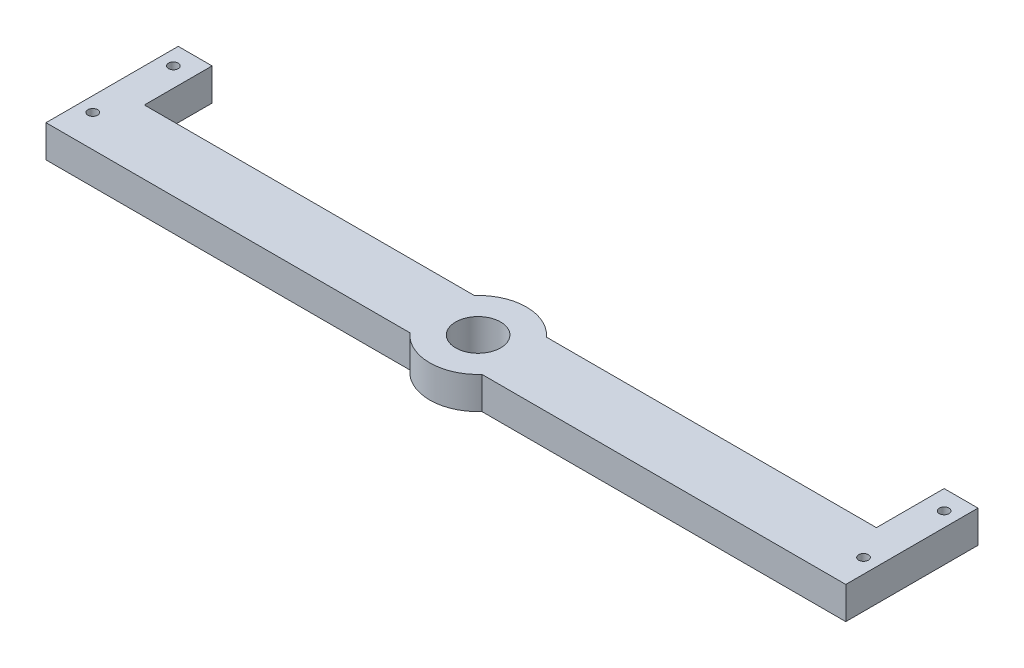
ISO-10303-21;
HEADER;
FILE_DESCRIPTION(('STEP AP214'),'2;1');
FILE_NAME('part.step','',(''),(''),'','','');
FILE_SCHEMA(('AUTOMOTIVE_DESIGN { 1 0 10303 214 1 1 1 1 }'));
ENDSEC;
DATA;
#1=APPLICATION_CONTEXT('core data for automotive mechanical design processes');
#2=APPLICATION_PROTOCOL_DEFINITION('international standard','automotive_design',2000,#1);
#3=PRODUCT_CONTEXT('',#1,'mechanical');
#4=PRODUCT('Part','Part','',(#3));
#5=PRODUCT_RELATED_PRODUCT_CATEGORY('part','',(#4));
#6=PRODUCT_DEFINITION_FORMATION('','',#4);
#7=PRODUCT_DEFINITION_CONTEXT('part definition',#1,'design');
#8=PRODUCT_DEFINITION('design','',#6,#7);
#9=PRODUCT_DEFINITION_SHAPE('','',#8);
#10=(LENGTH_UNIT() NAMED_UNIT(*) SI_UNIT(.MILLI.,.METRE.));
#11=(NAMED_UNIT(*) PLANE_ANGLE_UNIT() SI_UNIT($,.RADIAN.));
#12=(NAMED_UNIT(*) SI_UNIT($,.STERADIAN.) SOLID_ANGLE_UNIT());
#13=UNCERTAINTY_MEASURE_WITH_UNIT(LENGTH_MEASURE(1.E-05),#10,'distance_accuracy_value','');
#14=(GEOMETRIC_REPRESENTATION_CONTEXT(3) GLOBAL_UNCERTAINTY_ASSIGNED_CONTEXT((#13)) GLOBAL_UNIT_ASSIGNED_CONTEXT((#10,
#11,#12)) REPRESENTATION_CONTEXT('',''));
#15=CARTESIAN_POINT('',(0.,0.,0.));
#16=DIRECTION('',(0.,0.,1.));
#17=DIRECTION('',(1.,0.,0.));
#18=AXIS2_PLACEMENT_3D('',#15,#16,#17);
#19=CARTESIAN_POINT('',(0.,10.,0.));
#20=DIRECTION('',(0.,1.,0.));
#21=DIRECTION('',(0.,0.,1.));
#22=AXIS2_PLACEMENT_3D('',#19,#20,#21);
#23=PLANE('',#22);
#24=CARTESIAN_POINT('',(-119.5,10.,-25.));
#25=DIRECTION('',(0.,1.,0.));
#26=DIRECTION('',(0.,0.,1.));
#27=AXIS2_PLACEMENT_3D('',#24,#25,#26);
#28=CIRCLE('',#27,1.5);
#29=CARTESIAN_POINT('',(-119.5,10.,-23.5));
#30=VERTEX_POINT('',#29);
#31=EDGE_CURVE('E312',#30,#30,#28,.T.);
#32=ORIENTED_EDGE('',*,*,#31,.F.);
#33=EDGE_LOOP('',(#32));
#34=FACE_BOUND('',#33,.T.);
#35=CARTESIAN_POINT('',(119.5,10.,-4.42238838142354E-13));
#36=DIRECTION('',(0.,1.,0.));
#37=DIRECTION('',(0.,0.,-1.));
#38=AXIS2_PLACEMENT_3D('',#35,#36,#37);
#39=CIRCLE('',#38,1.5);
#40=CARTESIAN_POINT('',(119.5,10.,-1.50000000000044));
#41=VERTEX_POINT('',#40);
#42=EDGE_CURVE('E296',#41,#41,#39,.T.);
#43=ORIENTED_EDGE('',*,*,#42,.F.);
#44=EDGE_LOOP('',(#43));
#45=FACE_BOUND('',#44,.T.);
#46=DIRECTION('',(0.,0.,-1.));
#47=VECTOR('',#46,1.);
#48=CARTESIAN_POINT('',(124.,10.,-10.));
#49=LINE('',#48,#47);
#50=CARTESIAN_POINT('',(124.,10.,10.));
#51=VERTEX_POINT('',#50);
#52=CARTESIAN_POINT('',(124.,10.,-31.));
#53=VERTEX_POINT('',#52);
#54=EDGE_CURVE('E57',#51,#53,#49,.T.);
#55=ORIENTED_EDGE('',*,*,#54,.T.);
#56=DIRECTION('',(-1.,0.,0.));
#57=VECTOR('',#56,1.);
#58=CARTESIAN_POINT('',(124.,10.,-31.));
#59=LINE('',#58,#57);
#60=CARTESIAN_POINT('',(113.5,10.,-31.));
#61=VERTEX_POINT('',#60);
#62=EDGE_CURVE('E113',#53,#61,#59,.T.);
#63=ORIENTED_EDGE('',*,*,#62,.T.);
#64=DIRECTION('',(0.,0.,1.));
#65=VECTOR('',#64,1.);
#66=CARTESIAN_POINT('',(113.5,10.,-31.));
#67=LINE('',#66,#65);
#68=CARTESIAN_POINT('',(113.5,10.,-10.0000000000004));
#69=VERTEX_POINT('',#68);
#70=EDGE_CURVE('E240',#61,#69,#67,.T.);
#71=ORIENTED_EDGE('',*,*,#70,.T.);
#72=DIRECTION('',(-1.,0.,0.));
#73=VECTOR('',#72,1.);
#74=CARTESIAN_POINT('',(11.1803398874989,10.,-10.));
#75=LINE('',#74,#73);
#76=CARTESIAN_POINT('',(11.1803398874989,10.,-10.));
#77=VERTEX_POINT('',#76);
#78=EDGE_CURVE('E261',#69,#77,#75,.T.);
#79=ORIENTED_EDGE('',*,*,#78,.T.);
#80=CARTESIAN_POINT('',(0.,10.,0.));
#81=DIRECTION('',(0.,1.,0.));
#82=DIRECTION('',(0.,0.,1.));
#83=AXIS2_PLACEMENT_3D('',#80,#81,#82);
#84=CIRCLE('',#83,15.);
#85=CARTESIAN_POINT('',(-11.1803398874989,10.,-10.));
#86=VERTEX_POINT('',#85);
#87=EDGE_CURVE('E257',#77,#86,#84,.T.);
#88=ORIENTED_EDGE('',*,*,#87,.T.);
#89=DIRECTION('',(-1.,0.,0.));
#90=VECTOR('',#89,1.);
#91=CARTESIAN_POINT('',(-113.5,10.,-10.));
#92=LINE('',#91,#90);
#93=CARTESIAN_POINT('',(-113.5,10.,-10.));
#94=VERTEX_POINT('',#93);
#95=EDGE_CURVE('E260',#86,#94,#92,.T.);
#96=ORIENTED_EDGE('',*,*,#95,.T.);
#97=DIRECTION('',(0.,0.,-1.));
#98=VECTOR('',#97,1.);
#99=CARTESIAN_POINT('',(-113.5,10.,-31.));
#100=LINE('',#99,#98);
#101=CARTESIAN_POINT('',(-113.5,10.,-31.));
#102=VERTEX_POINT('',#101);
#103=EDGE_CURVE('E265',#94,#102,#100,.T.);
#104=ORIENTED_EDGE('',*,*,#103,.T.);
#105=DIRECTION('',(-1.,0.,0.));
#106=VECTOR('',#105,1.);
#107=CARTESIAN_POINT('',(-124.,10.,-31.));
#108=LINE('',#107,#106);
#109=CARTESIAN_POINT('',(-124.,10.,-31.));
#110=VERTEX_POINT('',#109);
#111=EDGE_CURVE('E272',#102,#110,#108,.T.);
#112=ORIENTED_EDGE('',*,*,#111,.T.);
#113=DIRECTION('',(0.,0.,1.));
#114=VECTOR('',#113,1.);
#115=CARTESIAN_POINT('',(-124.,10.,-10.));
#116=LINE('',#115,#114);
#117=CARTESIAN_POINT('',(-124.,10.,10.));
#118=VERTEX_POINT('',#117);
#119=EDGE_CURVE('E145',#110,#118,#116,.T.);
#120=ORIENTED_EDGE('',*,*,#119,.T.);
#121=DIRECTION('',(1.,0.,0.));
#122=VECTOR('',#121,1.);
#123=CARTESIAN_POINT('',(-124.,10.,10.));
#124=LINE('',#123,#122);
#125=CARTESIAN_POINT('',(-11.1803398874989,10.,10.));
#126=VERTEX_POINT('',#125);
#127=EDGE_CURVE('E139',#118,#126,#124,.T.);
#128=ORIENTED_EDGE('',*,*,#127,.T.);
#129=CARTESIAN_POINT('',(0.,10.,0.));
#130=DIRECTION('',(0.,1.,0.));
#131=DIRECTION('',(0.,0.,1.));
#132=AXIS2_PLACEMENT_3D('',#129,#130,#131);
#133=CIRCLE('',#132,15.);
#134=CARTESIAN_POINT('',(11.1803398874989,10.,10.));
#135=VERTEX_POINT('',#134);
#136=EDGE_CURVE('E143',#126,#135,#133,.T.);
#137=ORIENTED_EDGE('',*,*,#136,.T.);
#138=DIRECTION('',(1.,0.,0.));
#139=VECTOR('',#138,1.);
#140=CARTESIAN_POINT('',(11.1803398874989,10.,10.));
#141=LINE('',#140,#139);
#142=EDGE_CURVE('E162',#135,#51,#141,.T.);
#143=ORIENTED_EDGE('',*,*,#142,.T.);
#144=EDGE_LOOP('',(#55,#63,#71,#79,#88,#96,#104,#112,#120,#128,#137,#143));
#145=FACE_BOUND('',#144,.T.);
#146=CARTESIAN_POINT('',(-119.5,10.,0.));
#147=DIRECTION('',(0.,1.,0.));
#148=DIRECTION('',(0.,0.,1.));
#149=AXIS2_PLACEMENT_3D('',#146,#147,#148);
#150=CIRCLE('',#149,1.5);
#151=CARTESIAN_POINT('',(-119.5,10.,1.5));
#152=VERTEX_POINT('',#151);
#153=EDGE_CURVE('E173',#152,#152,#150,.T.);
#154=ORIENTED_EDGE('',*,*,#153,.F.);
#155=EDGE_LOOP('',(#154));
#156=FACE_BOUND('',#155,.T.);
#157=CARTESIAN_POINT('',(0.,10.,0.));
#158=DIRECTION('',(0.,1.,0.));
#159=DIRECTION('',(0.,0.,1.));
#160=AXIS2_PLACEMENT_3D('',#157,#158,#159);
#161=CIRCLE('',#160,6.975);
#162=CARTESIAN_POINT('',(0.,10.,6.975));
#163=VERTEX_POINT('',#162);
#164=EDGE_CURVE('E304',#163,#163,#161,.T.);
#165=ORIENTED_EDGE('',*,*,#164,.F.);
#166=EDGE_LOOP('',(#165));
#167=FACE_BOUND('',#166,.T.);
#168=CARTESIAN_POINT('',(119.5,10.,-25.));
#169=DIRECTION('',(0.,1.,0.));
#170=DIRECTION('',(0.,0.,-1.));
#171=AXIS2_PLACEMENT_3D('',#168,#169,#170);
#172=CIRCLE('',#171,1.5);
#173=CARTESIAN_POINT('',(119.5,10.,-26.5));
#174=VERTEX_POINT('',#173);
#175=EDGE_CURVE('E320',#174,#174,#172,.T.);
#176=ORIENTED_EDGE('',*,*,#175,.F.);
#177=EDGE_LOOP('',(#176));
#178=FACE_BOUND('',#177,.T.);
#179=ADVANCED_FACE('F39',(#34,#45,#145,#156,#167,#178),#23,.T.);
#180=CARTESIAN_POINT('',(0.,0.,0.));
#181=DIRECTION('',(0.,1.,0.));
#182=DIRECTION('',(0.,0.,1.));
#183=AXIS2_PLACEMENT_3D('',#180,#181,#182);
#184=PLANE('',#183);
#185=DIRECTION('',(-1.,0.,0.));
#186=VECTOR('',#185,1.);
#187=CARTESIAN_POINT('',(124.,0.,-31.));
#188=LINE('',#187,#186);
#189=CARTESIAN_POINT('',(124.,0.,-31.));
#190=VERTEX_POINT('',#189);
#191=CARTESIAN_POINT('',(113.5,0.,-31.));
#192=VERTEX_POINT('',#191);
#193=EDGE_CURVE('E169',#190,#192,#188,.T.);
#194=ORIENTED_EDGE('',*,*,#193,.F.);
#195=DIRECTION('',(0.,0.,-1.));
#196=VECTOR('',#195,1.);
#197=CARTESIAN_POINT('',(124.,0.,10.));
#198=LINE('',#197,#196);
#199=CARTESIAN_POINT('',(124.,0.,10.));
#200=VERTEX_POINT('',#199);
#201=EDGE_CURVE('E201',#200,#190,#198,.T.);
#202=ORIENTED_EDGE('',*,*,#201,.F.);
#203=DIRECTION('',(1.,0.,0.));
#204=VECTOR('',#203,1.);
#205=CARTESIAN_POINT('',(11.1803398874989,0.,10.));
#206=LINE('',#205,#204);
#207=CARTESIAN_POINT('',(11.1803398874989,0.,10.));
#208=VERTEX_POINT('',#207);
#209=EDGE_CURVE('E106',#208,#200,#206,.T.);
#210=ORIENTED_EDGE('',*,*,#209,.F.);
#211=CARTESIAN_POINT('',(0.,0.,0.));
#212=DIRECTION('',(0.,1.,0.));
#213=DIRECTION('',(0.,0.,1.));
#214=AXIS2_PLACEMENT_3D('',#211,#212,#213);
#215=CIRCLE('',#214,15.);
#216=CARTESIAN_POINT('',(-11.1803398874989,0.,10.));
#217=VERTEX_POINT('',#216);
#218=EDGE_CURVE('E99',#217,#208,#215,.T.);
#219=ORIENTED_EDGE('',*,*,#218,.F.);
#220=DIRECTION('',(1.,0.,0.));
#221=VECTOR('',#220,1.);
#222=CARTESIAN_POINT('',(-124.,0.,10.));
#223=LINE('',#222,#221);
#224=CARTESIAN_POINT('',(-124.,0.,10.));
#225=VERTEX_POINT('',#224);
#226=EDGE_CURVE('E154',#225,#217,#223,.T.);
#227=ORIENTED_EDGE('',*,*,#226,.F.);
#228=DIRECTION('',(0.,0.,1.));
#229=VECTOR('',#228,1.);
#230=CARTESIAN_POINT('',(-124.,0.,10.));
#231=LINE('',#230,#229);
#232=CARTESIAN_POINT('',(-124.,0.,-31.));
#233=VERTEX_POINT('',#232);
#234=EDGE_CURVE('E192',#233,#225,#231,.T.);
#235=ORIENTED_EDGE('',*,*,#234,.F.);
#236=DIRECTION('',(-1.,0.,0.));
#237=VECTOR('',#236,1.);
#238=CARTESIAN_POINT('',(-124.,0.,-31.));
#239=LINE('',#238,#237);
#240=CARTESIAN_POINT('',(-113.5,0.,-31.));
#241=VERTEX_POINT('',#240);
#242=EDGE_CURVE('E188',#241,#233,#239,.T.);
#243=ORIENTED_EDGE('',*,*,#242,.F.);
#244=DIRECTION('',(0.,0.,-1.));
#245=VECTOR('',#244,1.);
#246=CARTESIAN_POINT('',(-113.5,0.,-31.));
#247=LINE('',#246,#245);
#248=CARTESIAN_POINT('',(-113.5,0.,-10.));
#249=VERTEX_POINT('',#248);
#250=EDGE_CURVE('E185',#249,#241,#247,.T.);
#251=ORIENTED_EDGE('',*,*,#250,.F.);
#252=DIRECTION('',(-1.,0.,0.));
#253=VECTOR('',#252,1.);
#254=CARTESIAN_POINT('',(-113.5,0.,-10.));
#255=LINE('',#254,#253);
#256=CARTESIAN_POINT('',(-11.1803398874989,0.,-10.));
#257=VERTEX_POINT('',#256);
#258=EDGE_CURVE('E182',#257,#249,#255,.T.);
#259=ORIENTED_EDGE('',*,*,#258,.F.);
#260=CARTESIAN_POINT('',(0.,0.,0.));
#261=DIRECTION('',(0.,1.,0.));
#262=DIRECTION('',(0.,0.,1.));
#263=AXIS2_PLACEMENT_3D('',#260,#261,#262);
#264=CIRCLE('',#263,15.);
#265=CARTESIAN_POINT('',(11.1803398874989,0.,-10.));
#266=VERTEX_POINT('',#265);
#267=EDGE_CURVE('E179',#266,#257,#264,.T.);
#268=ORIENTED_EDGE('',*,*,#267,.F.);
#269=DIRECTION('',(-1.,0.,0.));
#270=VECTOR('',#269,1.);
#271=CARTESIAN_POINT('',(11.1803398874989,0.,-10.));
#272=LINE('',#271,#270);
#273=CARTESIAN_POINT('',(113.5,0.,-10.0000000000004));
#274=VERTEX_POINT('',#273);
#275=EDGE_CURVE('E176',#274,#266,#272,.T.);
#276=ORIENTED_EDGE('',*,*,#275,.F.);
#277=DIRECTION('',(0.,0.,1.));
#278=VECTOR('',#277,1.);
#279=CARTESIAN_POINT('',(113.5,0.,-31.));
#280=LINE('',#279,#278);
#281=EDGE_CURVE('E172',#192,#274,#280,.T.);
#282=ORIENTED_EDGE('',*,*,#281,.F.);
#283=EDGE_LOOP('',(#194,#202,#210,#219,#227,#235,#243,#251,#259,#268,#276,#282));
#284=FACE_BOUND('',#283,.T.);
#285=CARTESIAN_POINT('',(-119.5,0.,0.));
#286=DIRECTION('',(0.,1.,0.));
#287=DIRECTION('',(0.,0.,1.));
#288=AXIS2_PLACEMENT_3D('',#285,#286,#287);
#289=CIRCLE('',#288,1.5);
#290=CARTESIAN_POINT('',(-119.5,0.,1.5));
#291=VERTEX_POINT('',#290);
#292=EDGE_CURVE('E291',#291,#291,#289,.T.);
#293=ORIENTED_EDGE('',*,*,#292,.T.);
#294=EDGE_LOOP('',(#293));
#295=FACE_BOUND('',#294,.T.);
#296=CARTESIAN_POINT('',(119.5,0.,-4.42238838142354E-13));
#297=DIRECTION('',(0.,1.,0.));
#298=DIRECTION('',(0.,0.,-1.));
#299=AXIS2_PLACEMENT_3D('',#296,#297,#298);
#300=CIRCLE('',#299,1.5);
#301=CARTESIAN_POINT('',(119.5,0.,-1.50000000000044));
#302=VERTEX_POINT('',#301);
#303=EDGE_CURVE('E300',#302,#302,#300,.T.);
#304=ORIENTED_EDGE('',*,*,#303,.T.);
#305=EDGE_LOOP('',(#304));
#306=FACE_BOUND('',#305,.T.);
#307=CARTESIAN_POINT('',(0.,0.,0.));
#308=DIRECTION('',(0.,1.,0.));
#309=DIRECTION('',(0.,0.,1.));
#310=AXIS2_PLACEMENT_3D('',#307,#308,#309);
#311=CIRCLE('',#310,6.975);
#312=CARTESIAN_POINT('',(0.,0.,6.975));
#313=VERTEX_POINT('',#312);
#314=EDGE_CURVE('E308',#313,#313,#311,.T.);
#315=ORIENTED_EDGE('',*,*,#314,.T.);
#316=EDGE_LOOP('',(#315));
#317=FACE_BOUND('',#316,.T.);
#318=CARTESIAN_POINT('',(-119.5,0.,-25.));
#319=DIRECTION('',(0.,1.,0.));
#320=DIRECTION('',(0.,0.,1.));
#321=AXIS2_PLACEMENT_3D('',#318,#319,#320);
#322=CIRCLE('',#321,1.5);
#323=CARTESIAN_POINT('',(-119.5,0.,-23.5));
#324=VERTEX_POINT('',#323);
#325=EDGE_CURVE('E316',#324,#324,#322,.T.);
#326=ORIENTED_EDGE('',*,*,#325,.T.);
#327=EDGE_LOOP('',(#326));
#328=FACE_BOUND('',#327,.T.);
#329=CARTESIAN_POINT('',(119.5,0.,-25.));
#330=DIRECTION('',(0.,1.,0.));
#331=DIRECTION('',(0.,0.,-1.));
#332=AXIS2_PLACEMENT_3D('',#329,#330,#331);
#333=CIRCLE('',#332,1.5);
#334=CARTESIAN_POINT('',(119.5,0.,-26.5));
#335=VERTEX_POINT('',#334);
#336=EDGE_CURVE('E324',#335,#335,#333,.T.);
#337=ORIENTED_EDGE('',*,*,#336,.T.);
#338=EDGE_LOOP('',(#337));
#339=FACE_BOUND('',#338,.T.);
#340=ADVANCED_FACE('F244',(#284,#295,#306,#317,#328,#339),#184,.F.);
#341=CARTESIAN_POINT('',(124.,10.,-31.));
#342=DIRECTION('',(0.,0.,1.));
#343=DIRECTION('',(1.,0.,0.));
#344=AXIS2_PLACEMENT_3D('',#341,#342,#343);
#345=PLANE('',#344);
#346=ORIENTED_EDGE('',*,*,#193,.T.);
#347=DIRECTION('',(0.,-1.,0.));
#348=VECTOR('',#347,1.);
#349=CARTESIAN_POINT('',(113.5,10.,-31.));
#350=LINE('',#349,#348);
#351=EDGE_CURVE('E49',#61,#192,#350,.T.);
#352=ORIENTED_EDGE('',*,*,#351,.F.);
#353=ORIENTED_EDGE('',*,*,#62,.F.);
#354=DIRECTION('',(0.,-1.,0.));
#355=VECTOR('',#354,1.);
#356=CARTESIAN_POINT('',(124.,10.,-31.));
#357=LINE('',#356,#355);
#358=EDGE_CURVE('E11',#53,#190,#357,.T.);
#359=ORIENTED_EDGE('',*,*,#358,.T.);
#360=EDGE_LOOP('',(#346,#352,#353,#359));
#361=FACE_BOUND('',#360,.T.);
#362=ADVANCED_FACE('F41',(#361),#345,.F.);
#363=CARTESIAN_POINT('',(113.5,10.,-31.));
#364=DIRECTION('',(1.,0.,0.));
#365=DIRECTION('',(0.,0.,-1.));
#366=AXIS2_PLACEMENT_3D('',#363,#364,#365);
#367=PLANE('',#366);
#368=ORIENTED_EDGE('',*,*,#281,.T.);
#369=DIRECTION('',(0.,-1.,0.));
#370=VECTOR('',#369,1.);
#371=CARTESIAN_POINT('',(113.5,10.,-10.0000000000004));
#372=LINE('',#371,#370);
#373=EDGE_CURVE('E230',#69,#274,#372,.T.);
#374=ORIENTED_EDGE('',*,*,#373,.F.);
#375=ORIENTED_EDGE('',*,*,#70,.F.);
#376=ORIENTED_EDGE('',*,*,#351,.T.);
#377=EDGE_LOOP('',(#368,#374,#375,#376));
#378=FACE_BOUND('',#377,.T.);
#379=ADVANCED_FACE('F238',(#378),#367,.F.);
#380=CARTESIAN_POINT('',(11.1803398874989,10.,-10.));
#381=DIRECTION('',(0.,0.,1.));
#382=DIRECTION('',(1.,0.,0.));
#383=AXIS2_PLACEMENT_3D('',#380,#381,#382);
#384=PLANE('',#383);
#385=ORIENTED_EDGE('',*,*,#275,.T.);
#386=DIRECTION('',(0.,-1.,0.));
#387=VECTOR('',#386,1.);
#388=CARTESIAN_POINT('',(11.1803398874989,10.,-10.));
#389=LINE('',#388,#387);
#390=EDGE_CURVE('E226',#77,#266,#389,.T.);
#391=ORIENTED_EDGE('',*,*,#390,.F.);
#392=ORIENTED_EDGE('',*,*,#78,.F.);
#393=ORIENTED_EDGE('',*,*,#373,.T.);
#394=EDGE_LOOP('',(#385,#391,#392,#393));
#395=FACE_BOUND('',#394,.T.);
#396=ADVANCED_FACE('F251',(#395),#384,.F.);
#397=CARTESIAN_POINT('',(0.,10.,0.));
#398=DIRECTION('',(0.,-1.,0.));
#399=DIRECTION('',(0.,0.,-1.));
#400=AXIS2_PLACEMENT_3D('',#397,#398,#399);
#401=CYLINDRICAL_SURFACE('',#400,15.);
#402=ORIENTED_EDGE('',*,*,#267,.T.);
#403=DIRECTION('',(0.,-1.,0.));
#404=VECTOR('',#403,1.);
#405=CARTESIAN_POINT('',(-11.1803398874989,10.,-10.));
#406=LINE('',#405,#404);
#407=EDGE_CURVE('E222',#86,#257,#406,.T.);
#408=ORIENTED_EDGE('',*,*,#407,.F.);
#409=ORIENTED_EDGE('',*,*,#87,.F.);
#410=ORIENTED_EDGE('',*,*,#390,.T.);
#411=EDGE_LOOP('',(#402,#408,#409,#410));
#412=FACE_BOUND('',#411,.T.);
#413=ADVANCED_FACE('F255',(#412),#401,.T.);
#414=CARTESIAN_POINT('',(-113.5,10.,-10.));
#415=DIRECTION('',(0.,0.,1.));
#416=DIRECTION('',(1.,0.,0.));
#417=AXIS2_PLACEMENT_3D('',#414,#415,#416);
#418=PLANE('',#417);
#419=ORIENTED_EDGE('',*,*,#258,.T.);
#420=DIRECTION('',(0.,-1.,0.));
#421=VECTOR('',#420,1.);
#422=CARTESIAN_POINT('',(-113.5,10.,-10.));
#423=LINE('',#422,#421);
#424=EDGE_CURVE('E218',#94,#249,#423,.T.);
#425=ORIENTED_EDGE('',*,*,#424,.F.);
#426=ORIENTED_EDGE('',*,*,#95,.F.);
#427=ORIENTED_EDGE('',*,*,#407,.T.);
#428=EDGE_LOOP('',(#419,#425,#426,#427));
#429=FACE_BOUND('',#428,.T.);
#430=ADVANCED_FACE('F363',(#429),#418,.F.);
#431=CARTESIAN_POINT('',(-113.5,10.,-31.));
#432=DIRECTION('',(-1.,0.,0.));
#433=DIRECTION('',(0.,0.,1.));
#434=AXIS2_PLACEMENT_3D('',#431,#432,#433);
#435=PLANE('',#434);
#436=ORIENTED_EDGE('',*,*,#250,.T.);
#437=DIRECTION('',(0.,-1.,0.));
#438=VECTOR('',#437,1.);
#439=CARTESIAN_POINT('',(-113.5,10.,-31.));
#440=LINE('',#439,#438);
#441=EDGE_CURVE('E214',#102,#241,#440,.T.);
#442=ORIENTED_EDGE('',*,*,#441,.F.);
#443=ORIENTED_EDGE('',*,*,#103,.F.);
#444=ORIENTED_EDGE('',*,*,#424,.T.);
#445=EDGE_LOOP('',(#436,#442,#443,#444));
#446=FACE_BOUND('',#445,.T.);
#447=ADVANCED_FACE('F360',(#446),#435,.F.);
#448=CARTESIAN_POINT('',(-124.,10.,-31.));
#449=DIRECTION('',(0.,0.,1.));
#450=DIRECTION('',(1.,0.,0.));
#451=AXIS2_PLACEMENT_3D('',#448,#449,#450);
#452=PLANE('',#451);
#453=ORIENTED_EDGE('',*,*,#242,.T.);
#454=DIRECTION('',(0.,-1.,0.));
#455=VECTOR('',#454,1.);
#456=CARTESIAN_POINT('',(-124.,10.,-31.));
#457=LINE('',#456,#455);
#458=EDGE_CURVE('E210',#110,#233,#457,.T.);
#459=ORIENTED_EDGE('',*,*,#458,.F.);
#460=ORIENTED_EDGE('',*,*,#111,.F.);
#461=ORIENTED_EDGE('',*,*,#441,.T.);
#462=EDGE_LOOP('',(#453,#459,#460,#461));
#463=FACE_BOUND('',#462,.T.);
#464=ADVANCED_FACE('F280',(#463),#452,.F.);
#465=CARTESIAN_POINT('',(-124.,10.,10.));
#466=DIRECTION('',(1.,0.,0.));
#467=DIRECTION('',(0.,0.,-1.));
#468=AXIS2_PLACEMENT_3D('',#465,#466,#467);
#469=PLANE('',#468);
#470=ORIENTED_EDGE('',*,*,#234,.T.);
#471=DIRECTION('',(0.,-1.,0.));
#472=VECTOR('',#471,1.);
#473=CARTESIAN_POINT('',(-124.,10.,10.));
#474=LINE('',#473,#472);
#475=EDGE_CURVE('E156',#118,#225,#474,.T.);
#476=ORIENTED_EDGE('',*,*,#475,.F.);
#477=ORIENTED_EDGE('',*,*,#119,.F.);
#478=ORIENTED_EDGE('',*,*,#458,.T.);
#479=EDGE_LOOP('',(#470,#476,#477,#478));
#480=FACE_BOUND('',#479,.T.);
#481=ADVANCED_FACE('F283',(#480),#469,.F.);
#482=CARTESIAN_POINT('',(-124.,10.,10.));
#483=DIRECTION('',(0.,0.,-1.));
#484=DIRECTION('',(-1.,0.,0.));
#485=AXIS2_PLACEMENT_3D('',#482,#483,#484);
#486=PLANE('',#485);
#487=ORIENTED_EDGE('',*,*,#226,.T.);
#488=DIRECTION('',(0.,-1.,0.));
#489=VECTOR('',#488,1.);
#490=CARTESIAN_POINT('',(-11.1803398874989,10.,10.));
#491=LINE('',#490,#489);
#492=EDGE_CURVE('E151',#126,#217,#491,.T.);
#493=ORIENTED_EDGE('',*,*,#492,.F.);
#494=ORIENTED_EDGE('',*,*,#127,.F.);
#495=ORIENTED_EDGE('',*,*,#475,.T.);
#496=EDGE_LOOP('',(#487,#493,#494,#495));
#497=FACE_BOUND('',#496,.T.);
#498=ADVANCED_FACE('F152',(#497),#486,.F.);
#499=CARTESIAN_POINT('',(0.,10.,0.));
#500=DIRECTION('',(0.,-1.,0.));
#501=DIRECTION('',(0.,0.,-1.));
#502=AXIS2_PLACEMENT_3D('',#499,#500,#501);
#503=CYLINDRICAL_SURFACE('',#502,15.);
#504=ORIENTED_EDGE('',*,*,#218,.T.);
#505=DIRECTION('',(0.,-1.,0.));
#506=VECTOR('',#505,1.);
#507=CARTESIAN_POINT('',(11.1803398874989,10.,10.));
#508=LINE('',#507,#506);
#509=EDGE_CURVE('E157',#135,#208,#508,.T.);
#510=ORIENTED_EDGE('',*,*,#509,.F.);
#511=ORIENTED_EDGE('',*,*,#136,.F.);
#512=ORIENTED_EDGE('',*,*,#492,.T.);
#513=EDGE_LOOP('',(#504,#510,#511,#512));
#514=FACE_BOUND('',#513,.T.);
#515=ADVANCED_FACE('F159',(#514),#503,.T.);
#516=CARTESIAN_POINT('',(11.1803398874989,10.,10.));
#517=DIRECTION('',(0.,0.,-1.));
#518=DIRECTION('',(-1.,0.,0.));
#519=AXIS2_PLACEMENT_3D('',#516,#517,#518);
#520=PLANE('',#519);
#521=ORIENTED_EDGE('',*,*,#209,.T.);
#522=DIRECTION('',(0.,-1.,0.));
#523=VECTOR('',#522,1.);
#524=CARTESIAN_POINT('',(124.,10.,10.));
#525=LINE('',#524,#523);
#526=EDGE_CURVE('E165',#51,#200,#525,.T.);
#527=ORIENTED_EDGE('',*,*,#526,.F.);
#528=ORIENTED_EDGE('',*,*,#142,.F.);
#529=ORIENTED_EDGE('',*,*,#509,.T.);
#530=EDGE_LOOP('',(#521,#527,#528,#529));
#531=FACE_BOUND('',#530,.T.);
#532=ADVANCED_FACE('F285',(#531),#520,.F.);
#533=CARTESIAN_POINT('',(124.,10.,10.));
#534=DIRECTION('',(-1.,0.,0.));
#535=DIRECTION('',(0.,0.,1.));
#536=AXIS2_PLACEMENT_3D('',#533,#534,#535);
#537=PLANE('',#536);
#538=ORIENTED_EDGE('',*,*,#201,.T.);
#539=ORIENTED_EDGE('',*,*,#358,.F.);
#540=ORIENTED_EDGE('',*,*,#54,.F.);
#541=ORIENTED_EDGE('',*,*,#526,.T.);
#542=EDGE_LOOP('',(#538,#539,#540,#541));
#543=FACE_BOUND('',#542,.T.);
#544=ADVANCED_FACE('F284',(#543),#537,.F.);
#545=CARTESIAN_POINT('',(-119.5,10.,0.));
#546=DIRECTION('',(0.,-1.,0.));
#547=DIRECTION('',(0.,0.,-1.));
#548=AXIS2_PLACEMENT_3D('',#545,#546,#547);
#549=CYLINDRICAL_SURFACE('',#548,1.5);
#550=ORIENTED_EDGE('',*,*,#153,.T.);
#551=EDGE_LOOP('',(#550));
#552=FACE_BOUND('',#551,.T.);
#553=ORIENTED_EDGE('',*,*,#292,.F.);
#554=EDGE_LOOP('',(#553));
#555=FACE_BOUND('',#554,.T.);
#556=ADVANCED_FACE('F345',(#552,#555),#549,.F.);
#557=CARTESIAN_POINT('',(119.5,10.,-4.42238838142354E-13));
#558=DIRECTION('',(0.,-1.,0.));
#559=DIRECTION('',(0.,0.,-1.));
#560=AXIS2_PLACEMENT_3D('',#557,#558,#559);
#561=CYLINDRICAL_SURFACE('',#560,1.5);
#562=ORIENTED_EDGE('',*,*,#42,.T.);
#563=EDGE_LOOP('',(#562));
#564=FACE_BOUND('',#563,.T.);
#565=ORIENTED_EDGE('',*,*,#303,.F.);
#566=EDGE_LOOP('',(#565));
#567=FACE_BOUND('',#566,.T.);
#568=ADVANCED_FACE('F457',(#564,#567),#561,.F.);
#569=CARTESIAN_POINT('',(0.,10.,0.));
#570=DIRECTION('',(0.,-1.,0.));
#571=DIRECTION('',(0.,0.,-1.));
#572=AXIS2_PLACEMENT_3D('',#569,#570,#571);
#573=CYLINDRICAL_SURFACE('',#572,6.975);
#574=ORIENTED_EDGE('',*,*,#164,.T.);
#575=EDGE_LOOP('',(#574));
#576=FACE_BOUND('',#575,.T.);
#577=ORIENTED_EDGE('',*,*,#314,.F.);
#578=EDGE_LOOP('',(#577));
#579=FACE_BOUND('',#578,.T.);
#580=ADVANCED_FACE('F465',(#576,#579),#573,.F.);
#581=CARTESIAN_POINT('',(-119.5,10.,-25.));
#582=DIRECTION('',(0.,-1.,0.));
#583=DIRECTION('',(0.,0.,-1.));
#584=AXIS2_PLACEMENT_3D('',#581,#582,#583);
#585=CYLINDRICAL_SURFACE('',#584,1.5);
#586=ORIENTED_EDGE('',*,*,#31,.T.);
#587=EDGE_LOOP('',(#586));
#588=FACE_BOUND('',#587,.T.);
#589=ORIENTED_EDGE('',*,*,#325,.F.);
#590=EDGE_LOOP('',(#589));
#591=FACE_BOUND('',#590,.T.);
#592=ADVANCED_FACE('F473',(#588,#591),#585,.F.);
#593=CARTESIAN_POINT('',(119.5,10.,-25.));
#594=DIRECTION('',(0.,-1.,0.));
#595=DIRECTION('',(0.,0.,-1.));
#596=AXIS2_PLACEMENT_3D('',#593,#594,#595);
#597=CYLINDRICAL_SURFACE('',#596,1.5);
#598=ORIENTED_EDGE('',*,*,#175,.T.);
#599=EDGE_LOOP('',(#598));
#600=FACE_BOUND('',#599,.T.);
#601=ORIENTED_EDGE('',*,*,#336,.F.);
#602=EDGE_LOOP('',(#601));
#603=FACE_BOUND('',#602,.T.);
#604=ADVANCED_FACE('F332',(#600,#603),#597,.F.);
#605=CLOSED_SHELL('',(#179,#340,#362,#379,#396,#413,#430,#447,#464,#481,#498,#515,#532,#544,
#556,#568,#580,#592,#604));
#606=MANIFOLD_SOLID_BREP('B2',#605);
#607=ADVANCED_BREP_SHAPE_REPRESENTATION('',(#18,#606),#14);
#608=SHAPE_DEFINITION_REPRESENTATION(#9,#607);
ENDSEC;
END-ISO-10303-21;
